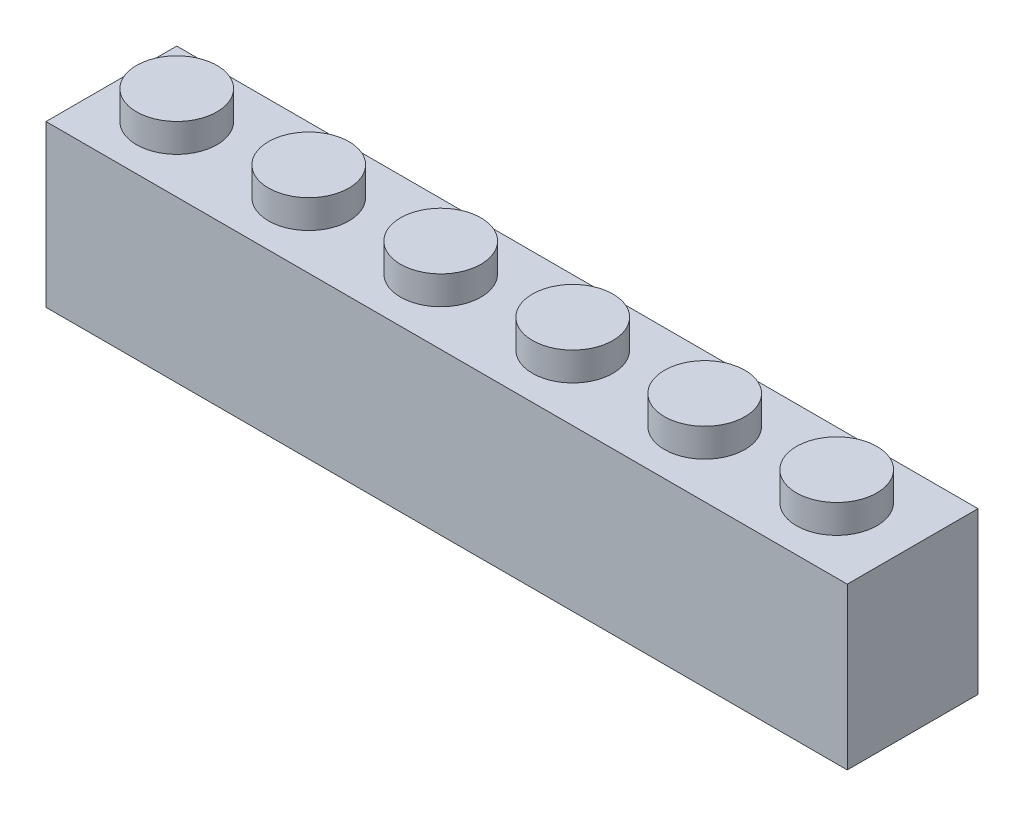
ISO-10303-21;
HEADER;
FILE_DESCRIPTION(('STEP AP214'),'2;1');
FILE_NAME('part.step','',(''),(''),'','','');
FILE_SCHEMA(('AUTOMOTIVE_DESIGN { 1 0 10303 214 1 1 1 1 }'));
ENDSEC;
DATA;
#1=APPLICATION_CONTEXT('core data for automotive mechanical design processes');
#2=APPLICATION_PROTOCOL_DEFINITION('international standard','automotive_design',2000,#1);
#3=PRODUCT_CONTEXT('',#1,'mechanical');
#4=PRODUCT('Part','Part','',(#3));
#5=PRODUCT_RELATED_PRODUCT_CATEGORY('part','',(#4));
#6=PRODUCT_DEFINITION_FORMATION('','',#4);
#7=PRODUCT_DEFINITION_CONTEXT('part definition',#1,'design');
#8=PRODUCT_DEFINITION('design','',#6,#7);
#9=PRODUCT_DEFINITION_SHAPE('','',#8);
#10=(LENGTH_UNIT() NAMED_UNIT(*) SI_UNIT(.MILLI.,.METRE.));
#11=(NAMED_UNIT(*) PLANE_ANGLE_UNIT() SI_UNIT($,.RADIAN.));
#12=(NAMED_UNIT(*) SI_UNIT($,.STERADIAN.) SOLID_ANGLE_UNIT());
#13=UNCERTAINTY_MEASURE_WITH_UNIT(LENGTH_MEASURE(1.E-05),#10,'distance_accuracy_value','');
#14=(GEOMETRIC_REPRESENTATION_CONTEXT(3) GLOBAL_UNCERTAINTY_ASSIGNED_CONTEXT((#13)) GLOBAL_UNIT_ASSIGNED_CONTEXT((#10,
#11,#12)) REPRESENTATION_CONTEXT('',''));
#15=CARTESIAN_POINT('',(0.,0.,0.));
#16=DIRECTION('',(0.,0.,1.));
#17=DIRECTION('',(1.,0.,0.));
#18=AXIS2_PLACEMENT_3D('',#15,#16,#17);
#19=CARTESIAN_POINT('',(-23.9,9.6,3.9));
#20=DIRECTION('',(1.,0.,0.));
#21=DIRECTION('',(0.,0.,-1.));
#22=AXIS2_PLACEMENT_3D('',#19,#20,#21);
#23=PLANE('',#22);
#24=DIRECTION('',(0.,0.,1.));
#25=VECTOR('',#24,1.);
#26=CARTESIAN_POINT('',(-23.9,0.,3.9));
#27=LINE('',#26,#25);
#28=CARTESIAN_POINT('',(-23.9,0.,-3.9));
#29=VERTEX_POINT('',#28);
#30=CARTESIAN_POINT('',(-23.9,0.,3.9));
#31=VERTEX_POINT('',#30);
#32=EDGE_CURVE('E96',#29,#31,#27,.T.);
#33=ORIENTED_EDGE('',*,*,#32,.T.);
#34=DIRECTION('',(0.,-1.,0.));
#35=VECTOR('',#34,1.);
#36=CARTESIAN_POINT('',(-23.9,9.6,3.9));
#37=LINE('',#36,#35);
#38=CARTESIAN_POINT('',(-23.9,9.6,3.9));
#39=VERTEX_POINT('',#38);
#40=EDGE_CURVE('E11',#39,#31,#37,.T.);
#41=ORIENTED_EDGE('',*,*,#40,.F.);
#42=DIRECTION('',(0.,0.,1.));
#43=VECTOR('',#42,1.);
#44=CARTESIAN_POINT('',(-23.9,9.6,3.9));
#45=LINE('',#44,#43);
#46=CARTESIAN_POINT('',(-23.9,9.6,-3.9));
#47=VERTEX_POINT('',#46);
#48=EDGE_CURVE('E84',#47,#39,#45,.T.);
#49=ORIENTED_EDGE('',*,*,#48,.F.);
#50=DIRECTION('',(0.,-1.,0.));
#51=VECTOR('',#50,1.);
#52=CARTESIAN_POINT('',(-23.9,9.6,-3.9));
#53=LINE('',#52,#51);
#54=EDGE_CURVE('E92',#47,#29,#53,.T.);
#55=ORIENTED_EDGE('',*,*,#54,.T.);
#56=EDGE_LOOP('',(#33,#41,#49,#55));
#57=FACE_BOUND('',#56,.T.);
#58=ADVANCED_FACE('F33',(#57),#23,.F.);
#59=CARTESIAN_POINT('',(23.9,9.6,3.89999999999999));
#60=DIRECTION('',(0.,0.,-1.));
#61=DIRECTION('',(-1.,0.,0.));
#62=AXIS2_PLACEMENT_3D('',#59,#60,#61);
#63=PLANE('',#62);
#64=DIRECTION('',(1.,0.,0.));
#65=VECTOR('',#64,1.);
#66=CARTESIAN_POINT('',(23.9,0.,3.89999999999999));
#67=LINE('',#66,#65);
#68=CARTESIAN_POINT('',(23.9,0.,3.89999999999999));
#69=VERTEX_POINT('',#68);
#70=EDGE_CURVE('E88',#31,#69,#67,.T.);
#71=ORIENTED_EDGE('',*,*,#70,.T.);
#72=DIRECTION('',(0.,-1.,0.));
#73=VECTOR('',#72,1.);
#74=CARTESIAN_POINT('',(23.9,9.6,3.89999999999999));
#75=LINE('',#74,#73);
#76=CARTESIAN_POINT('',(23.9,9.6,3.89999999999999));
#77=VERTEX_POINT('',#76);
#78=EDGE_CURVE('E41',#77,#69,#75,.T.);
#79=ORIENTED_EDGE('',*,*,#78,.F.);
#80=DIRECTION('',(1.,0.,0.));
#81=VECTOR('',#80,1.);
#82=CARTESIAN_POINT('',(23.9,9.6,3.89999999999999));
#83=LINE('',#82,#81);
#84=EDGE_CURVE('E79',#39,#77,#83,.T.);
#85=ORIENTED_EDGE('',*,*,#84,.F.);
#86=ORIENTED_EDGE('',*,*,#40,.T.);
#87=EDGE_LOOP('',(#71,#79,#85,#86));
#88=FACE_BOUND('',#87,.T.);
#89=ADVANCED_FACE('F87',(#88),#63,.F.);
#90=CARTESIAN_POINT('',(23.9,9.6,3.89999999999999));
#91=DIRECTION('',(-1.,0.,0.));
#92=DIRECTION('',(0.,0.,1.));
#93=AXIS2_PLACEMENT_3D('',#90,#91,#92);
#94=PLANE('',#93);
#95=DIRECTION('',(0.,0.,-1.));
#96=VECTOR('',#95,1.);
#97=CARTESIAN_POINT('',(23.9,0.,3.89999999999999));
#98=LINE('',#97,#96);
#99=CARTESIAN_POINT('',(23.9,0.,-3.9));
#100=VERTEX_POINT('',#99);
#101=EDGE_CURVE('E66',#69,#100,#98,.T.);
#102=ORIENTED_EDGE('',*,*,#101,.T.);
#103=DIRECTION('',(0.,-1.,0.));
#104=VECTOR('',#103,1.);
#105=CARTESIAN_POINT('',(23.9,9.6,-3.9));
#106=LINE('',#105,#104);
#107=CARTESIAN_POINT('',(23.9,9.6,-3.9));
#108=VERTEX_POINT('',#107);
#109=EDGE_CURVE('E89',#108,#100,#106,.T.);
#110=ORIENTED_EDGE('',*,*,#109,.F.);
#111=DIRECTION('',(0.,0.,-1.));
#112=VECTOR('',#111,1.);
#113=CARTESIAN_POINT('',(23.9,9.6,3.89999999999999));
#114=LINE('',#113,#112);
#115=EDGE_CURVE('E82',#77,#108,#114,.T.);
#116=ORIENTED_EDGE('',*,*,#115,.F.);
#117=ORIENTED_EDGE('',*,*,#78,.T.);
#118=EDGE_LOOP('',(#102,#110,#116,#117));
#119=FACE_BOUND('',#118,.T.);
#120=ADVANCED_FACE('F90',(#119),#94,.F.);
#121=CARTESIAN_POINT('',(23.9,9.6,-3.9));
#122=DIRECTION('',(0.,0.,1.));
#123=DIRECTION('',(1.,0.,0.));
#124=AXIS2_PLACEMENT_3D('',#121,#122,#123);
#125=PLANE('',#124);
#126=DIRECTION('',(-1.,0.,0.));
#127=VECTOR('',#126,1.);
#128=CARTESIAN_POINT('',(23.9,0.,-3.9));
#129=LINE('',#128,#127);
#130=EDGE_CURVE('E72',#100,#29,#129,.T.);
#131=ORIENTED_EDGE('',*,*,#130,.T.);
#132=ORIENTED_EDGE('',*,*,#54,.F.);
#133=DIRECTION('',(-1.,0.,0.));
#134=VECTOR('',#133,1.);
#135=CARTESIAN_POINT('',(23.9,9.6,-3.9));
#136=LINE('',#135,#134);
#137=EDGE_CURVE('E49',#108,#47,#136,.T.);
#138=ORIENTED_EDGE('',*,*,#137,.F.);
#139=ORIENTED_EDGE('',*,*,#109,.T.);
#140=EDGE_LOOP('',(#131,#132,#138,#139));
#141=FACE_BOUND('',#140,.T.);
#142=ADVANCED_FACE('F104',(#141),#125,.F.);
#143=CARTESIAN_POINT('',(0.,9.6,0.));
#144=DIRECTION('',(0.,1.,0.));
#145=DIRECTION('',(0.,0.,1.));
#146=AXIS2_PLACEMENT_3D('',#143,#144,#145);
#147=PLANE('',#146);
#148=CARTESIAN_POINT('',(19.37,9.6,0.));
#149=DIRECTION('',(0.,1.,0.));
#150=DIRECTION('',(0.,0.,1.));
#151=AXIS2_PLACEMENT_3D('',#148,#149,#150);
#152=CIRCLE('',#151,2.4);
#153=CARTESIAN_POINT('',(19.37,9.6,2.4));
#154=VERTEX_POINT('',#153);
#155=EDGE_CURVE('E140',#154,#154,#152,.T.);
#156=ORIENTED_EDGE('',*,*,#155,.F.);
#157=EDGE_LOOP('',(#156));
#158=FACE_BOUND('',#157,.T.);
#159=CARTESIAN_POINT('',(11.496,9.6,0.));
#160=DIRECTION('',(0.,1.,0.));
#161=DIRECTION('',(0.,0.,1.));
#162=AXIS2_PLACEMENT_3D('',#159,#160,#161);
#163=CIRCLE('',#162,2.4);
#164=CARTESIAN_POINT('',(11.496,9.6,2.4));
#165=VERTEX_POINT('',#164);
#166=EDGE_CURVE('E134',#165,#165,#163,.T.);
#167=ORIENTED_EDGE('',*,*,#166,.F.);
#168=EDGE_LOOP('',(#167));
#169=FACE_BOUND('',#168,.T.);
#170=CARTESIAN_POINT('',(3.62200000000001,9.6,0.));
#171=DIRECTION('',(0.,1.,0.));
#172=DIRECTION('',(0.,0.,1.));
#173=AXIS2_PLACEMENT_3D('',#170,#171,#172);
#174=CIRCLE('',#173,2.4);
#175=CARTESIAN_POINT('',(3.62200000000001,9.6,2.4));
#176=VERTEX_POINT('',#175);
#177=EDGE_CURVE('E128',#176,#176,#174,.T.);
#178=ORIENTED_EDGE('',*,*,#177,.F.);
#179=EDGE_LOOP('',(#178));
#180=FACE_BOUND('',#179,.T.);
#181=CARTESIAN_POINT('',(-4.25199999999998,9.6,0.));
#182=DIRECTION('',(0.,1.,0.));
#183=DIRECTION('',(0.,0.,1.));
#184=AXIS2_PLACEMENT_3D('',#181,#182,#183);
#185=CIRCLE('',#184,2.4);
#186=CARTESIAN_POINT('',(-4.25199999999998,9.6,2.4));
#187=VERTEX_POINT('',#186);
#188=EDGE_CURVE('E122',#187,#187,#185,.T.);
#189=ORIENTED_EDGE('',*,*,#188,.F.);
#190=EDGE_LOOP('',(#189));
#191=FACE_BOUND('',#190,.T.);
#192=CARTESIAN_POINT('',(-12.126,9.6,0.));
#193=DIRECTION('',(0.,1.,0.));
#194=DIRECTION('',(0.,0.,1.));
#195=AXIS2_PLACEMENT_3D('',#192,#193,#194);
#196=CIRCLE('',#195,2.4);
#197=CARTESIAN_POINT('',(-12.126,9.6,2.4));
#198=VERTEX_POINT('',#197);
#199=EDGE_CURVE('E116',#198,#198,#196,.T.);
#200=ORIENTED_EDGE('',*,*,#199,.F.);
#201=EDGE_LOOP('',(#200));
#202=FACE_BOUND('',#201,.T.);
#203=CARTESIAN_POINT('',(-20.,9.6,0.));
#204=DIRECTION('',(0.,1.,0.));
#205=DIRECTION('',(0.,0.,1.));
#206=AXIS2_PLACEMENT_3D('',#203,#204,#205);
#207=CIRCLE('',#206,2.4);
#208=CARTESIAN_POINT('',(-20.,9.6,2.4));
#209=VERTEX_POINT('',#208);
#210=EDGE_CURVE('E110',#209,#209,#207,.T.);
#211=ORIENTED_EDGE('',*,*,#210,.F.);
#212=EDGE_LOOP('',(#211));
#213=FACE_BOUND('',#212,.T.);
#214=ORIENTED_EDGE('',*,*,#48,.T.);
#215=ORIENTED_EDGE('',*,*,#84,.T.);
#216=ORIENTED_EDGE('',*,*,#115,.T.);
#217=ORIENTED_EDGE('',*,*,#137,.T.);
#218=EDGE_LOOP('',(#214,#215,#216,#217));
#219=FACE_BOUND('',#218,.T.);
#220=ADVANCED_FACE('F80',(#158,#169,#180,#191,#202,#213,#219),#147,.T.);
#221=CARTESIAN_POINT('',(0.,0.,0.));
#222=DIRECTION('',(0.,1.,0.));
#223=DIRECTION('',(0.,0.,1.));
#224=AXIS2_PLACEMENT_3D('',#221,#222,#223);
#225=PLANE('',#224);
#226=CARTESIAN_POINT('',(-20.,0.,0.));
#227=DIRECTION('',(0.,-1.,0.));
#228=DIRECTION('',(0.,0.,-1.));
#229=AXIS2_PLACEMENT_3D('',#226,#227,#228);
#230=CIRCLE('',#229,2.5);
#231=CARTESIAN_POINT('',(-20.,0.,-2.5));
#232=VERTEX_POINT('',#231);
#233=EDGE_CURVE('E176',#232,#232,#230,.T.);
#234=ORIENTED_EDGE('',*,*,#233,.F.);
#235=EDGE_LOOP('',(#234));
#236=FACE_BOUND('',#235,.T.);
#237=CARTESIAN_POINT('',(-12.126,0.,0.));
#238=DIRECTION('',(0.,-1.,0.));
#239=DIRECTION('',(0.,0.,-1.));
#240=AXIS2_PLACEMENT_3D('',#237,#238,#239);
#241=CIRCLE('',#240,2.5);
#242=CARTESIAN_POINT('',(-12.126,0.,-2.5));
#243=VERTEX_POINT('',#242);
#244=EDGE_CURVE('E170',#243,#243,#241,.T.);
#245=ORIENTED_EDGE('',*,*,#244,.F.);
#246=EDGE_LOOP('',(#245));
#247=FACE_BOUND('',#246,.T.);
#248=CARTESIAN_POINT('',(-4.25199999999998,0.,0.));
#249=DIRECTION('',(0.,-1.,0.));
#250=DIRECTION('',(0.,0.,-1.));
#251=AXIS2_PLACEMENT_3D('',#248,#249,#250);
#252=CIRCLE('',#251,2.5);
#253=CARTESIAN_POINT('',(-4.25199999999998,0.,-2.5));
#254=VERTEX_POINT('',#253);
#255=EDGE_CURVE('E164',#254,#254,#252,.T.);
#256=ORIENTED_EDGE('',*,*,#255,.F.);
#257=EDGE_LOOP('',(#256));
#258=FACE_BOUND('',#257,.T.);
#259=CARTESIAN_POINT('',(3.62200000000001,0.,0.));
#260=DIRECTION('',(0.,-1.,0.));
#261=DIRECTION('',(0.,0.,-1.));
#262=AXIS2_PLACEMENT_3D('',#259,#260,#261);
#263=CIRCLE('',#262,2.5);
#264=CARTESIAN_POINT('',(3.62200000000001,0.,-2.5));
#265=VERTEX_POINT('',#264);
#266=EDGE_CURVE('E158',#265,#265,#263,.T.);
#267=ORIENTED_EDGE('',*,*,#266,.F.);
#268=EDGE_LOOP('',(#267));
#269=FACE_BOUND('',#268,.T.);
#270=CARTESIAN_POINT('',(11.496,0.,0.));
#271=DIRECTION('',(0.,-1.,0.));
#272=DIRECTION('',(0.,0.,-1.));
#273=AXIS2_PLACEMENT_3D('',#270,#271,#272);
#274=CIRCLE('',#273,2.5);
#275=CARTESIAN_POINT('',(11.496,0.,-2.5));
#276=VERTEX_POINT('',#275);
#277=EDGE_CURVE('E152',#276,#276,#274,.T.);
#278=ORIENTED_EDGE('',*,*,#277,.F.);
#279=EDGE_LOOP('',(#278));
#280=FACE_BOUND('',#279,.T.);
#281=CARTESIAN_POINT('',(19.37,0.,0.));
#282=DIRECTION('',(0.,-1.,0.));
#283=DIRECTION('',(0.,0.,-1.));
#284=AXIS2_PLACEMENT_3D('',#281,#282,#283);
#285=CIRCLE('',#284,2.5);
#286=CARTESIAN_POINT('',(19.37,0.,-2.5));
#287=VERTEX_POINT('',#286);
#288=EDGE_CURVE('E146',#287,#287,#285,.T.);
#289=ORIENTED_EDGE('',*,*,#288,.F.);
#290=EDGE_LOOP('',(#289));
#291=FACE_BOUND('',#290,.T.);
#292=ORIENTED_EDGE('',*,*,#32,.F.);
#293=ORIENTED_EDGE('',*,*,#130,.F.);
#294=ORIENTED_EDGE('',*,*,#101,.F.);
#295=ORIENTED_EDGE('',*,*,#70,.F.);
#296=EDGE_LOOP('',(#292,#293,#294,#295));
#297=FACE_BOUND('',#296,.T.);
#298=ADVANCED_FACE('F107',(#236,#247,#258,#269,#280,#291,#297),#225,.F.);
#299=CARTESIAN_POINT('',(-20.,11.3,0.));
#300=DIRECTION('',(0.,-1.,0.));
#301=DIRECTION('',(0.,0.,-1.));
#302=AXIS2_PLACEMENT_3D('',#299,#300,#301);
#303=CYLINDRICAL_SURFACE('',#302,2.4);
#304=CARTESIAN_POINT('',(-20.,11.3,0.));
#305=DIRECTION('',(0.,1.,0.));
#306=DIRECTION('',(0.,0.,1.));
#307=AXIS2_PLACEMENT_3D('',#304,#305,#306);
#308=CIRCLE('',#307,2.4);
#309=CARTESIAN_POINT('',(-20.,11.3,2.4));
#310=VERTEX_POINT('',#309);
#311=EDGE_CURVE('E99',#310,#310,#308,.T.);
#312=ORIENTED_EDGE('',*,*,#311,.F.);
#313=EDGE_LOOP('',(#312));
#314=FACE_BOUND('',#313,.T.);
#315=ORIENTED_EDGE('',*,*,#210,.T.);
#316=EDGE_LOOP('',(#315));
#317=FACE_BOUND('',#316,.T.);
#318=ADVANCED_FACE('F193',(#314,#317),#303,.T.);
#319=CARTESIAN_POINT('',(-20.,11.3,0.));
#320=DIRECTION('',(0.,1.,0.));
#321=DIRECTION('',(0.,0.,1.));
#322=AXIS2_PLACEMENT_3D('',#319,#320,#321);
#323=PLANE('',#322);
#324=ORIENTED_EDGE('',*,*,#311,.T.);
#325=EDGE_LOOP('',(#324));
#326=FACE_BOUND('',#325,.T.);
#327=ADVANCED_FACE('F238',(#326),#323,.T.);
#328=CARTESIAN_POINT('',(-12.126,11.3,0.));
#329=DIRECTION('',(0.,-1.,0.));
#330=DIRECTION('',(0.,0.,-1.));
#331=AXIS2_PLACEMENT_3D('',#328,#329,#330);
#332=CYLINDRICAL_SURFACE('',#331,2.4);
#333=CARTESIAN_POINT('',(-12.126,11.3,0.));
#334=DIRECTION('',(0.,1.,0.));
#335=DIRECTION('',(0.,0.,1.));
#336=AXIS2_PLACEMENT_3D('',#333,#334,#335);
#337=CIRCLE('',#336,2.4);
#338=CARTESIAN_POINT('',(-12.126,11.3,2.4));
#339=VERTEX_POINT('',#338);
#340=EDGE_CURVE('E113',#339,#339,#337,.T.);
#341=ORIENTED_EDGE('',*,*,#340,.F.);
#342=EDGE_LOOP('',(#341));
#343=FACE_BOUND('',#342,.T.);
#344=ORIENTED_EDGE('',*,*,#199,.T.);
#345=EDGE_LOOP('',(#344));
#346=FACE_BOUND('',#345,.T.);
#347=ADVANCED_FACE('F242',(#343,#346),#332,.T.);
#348=CARTESIAN_POINT('',(-12.126,11.3,0.));
#349=DIRECTION('',(0.,1.,0.));
#350=DIRECTION('',(0.,0.,1.));
#351=AXIS2_PLACEMENT_3D('',#348,#349,#350);
#352=PLANE('',#351);
#353=ORIENTED_EDGE('',*,*,#340,.T.);
#354=EDGE_LOOP('',(#353));
#355=FACE_BOUND('',#354,.T.);
#356=ADVANCED_FACE('F246',(#355),#352,.T.);
#357=CARTESIAN_POINT('',(-4.25199999999998,11.3,0.));
#358=DIRECTION('',(0.,-1.,0.));
#359=DIRECTION('',(0.,0.,-1.));
#360=AXIS2_PLACEMENT_3D('',#357,#358,#359);
#361=CYLINDRICAL_SURFACE('',#360,2.4);
#362=CARTESIAN_POINT('',(-4.25199999999998,11.3,0.));
#363=DIRECTION('',(0.,1.,0.));
#364=DIRECTION('',(0.,0.,1.));
#365=AXIS2_PLACEMENT_3D('',#362,#363,#364);
#366=CIRCLE('',#365,2.4);
#367=CARTESIAN_POINT('',(-4.25199999999998,11.3,2.4));
#368=VERTEX_POINT('',#367);
#369=EDGE_CURVE('E119',#368,#368,#366,.T.);
#370=ORIENTED_EDGE('',*,*,#369,.F.);
#371=EDGE_LOOP('',(#370));
#372=FACE_BOUND('',#371,.T.);
#373=ORIENTED_EDGE('',*,*,#188,.T.);
#374=EDGE_LOOP('',(#373));
#375=FACE_BOUND('',#374,.T.);
#376=ADVANCED_FACE('F250',(#372,#375),#361,.T.);
#377=CARTESIAN_POINT('',(-4.25199999999998,11.3,0.));
#378=DIRECTION('',(0.,1.,0.));
#379=DIRECTION('',(0.,0.,1.));
#380=AXIS2_PLACEMENT_3D('',#377,#378,#379);
#381=PLANE('',#380);
#382=ORIENTED_EDGE('',*,*,#369,.T.);
#383=EDGE_LOOP('',(#382));
#384=FACE_BOUND('',#383,.T.);
#385=ADVANCED_FACE('F254',(#384),#381,.T.);
#386=CARTESIAN_POINT('',(3.62200000000001,11.3,0.));
#387=DIRECTION('',(0.,-1.,0.));
#388=DIRECTION('',(0.,0.,-1.));
#389=AXIS2_PLACEMENT_3D('',#386,#387,#388);
#390=CYLINDRICAL_SURFACE('',#389,2.4);
#391=CARTESIAN_POINT('',(3.62200000000001,11.3,0.));
#392=DIRECTION('',(0.,1.,0.));
#393=DIRECTION('',(0.,0.,1.));
#394=AXIS2_PLACEMENT_3D('',#391,#392,#393);
#395=CIRCLE('',#394,2.4);
#396=CARTESIAN_POINT('',(3.62200000000001,11.3,2.4));
#397=VERTEX_POINT('',#396);
#398=EDGE_CURVE('E125',#397,#397,#395,.T.);
#399=ORIENTED_EDGE('',*,*,#398,.F.);
#400=EDGE_LOOP('',(#399));
#401=FACE_BOUND('',#400,.T.);
#402=ORIENTED_EDGE('',*,*,#177,.T.);
#403=EDGE_LOOP('',(#402));
#404=FACE_BOUND('',#403,.T.);
#405=ADVANCED_FACE('F258',(#401,#404),#390,.T.);
#406=CARTESIAN_POINT('',(3.62200000000001,11.3,0.));
#407=DIRECTION('',(0.,1.,0.));
#408=DIRECTION('',(0.,0.,1.));
#409=AXIS2_PLACEMENT_3D('',#406,#407,#408);
#410=PLANE('',#409);
#411=ORIENTED_EDGE('',*,*,#398,.T.);
#412=EDGE_LOOP('',(#411));
#413=FACE_BOUND('',#412,.T.);
#414=ADVANCED_FACE('F262',(#413),#410,.T.);
#415=CARTESIAN_POINT('',(11.496,11.3,0.));
#416=DIRECTION('',(0.,-1.,0.));
#417=DIRECTION('',(0.,0.,-1.));
#418=AXIS2_PLACEMENT_3D('',#415,#416,#417);
#419=CYLINDRICAL_SURFACE('',#418,2.4);
#420=CARTESIAN_POINT('',(11.496,11.3,0.));
#421=DIRECTION('',(0.,1.,0.));
#422=DIRECTION('',(0.,0.,1.));
#423=AXIS2_PLACEMENT_3D('',#420,#421,#422);
#424=CIRCLE('',#423,2.4);
#425=CARTESIAN_POINT('',(11.496,11.3,2.4));
#426=VERTEX_POINT('',#425);
#427=EDGE_CURVE('E131',#426,#426,#424,.T.);
#428=ORIENTED_EDGE('',*,*,#427,.F.);
#429=EDGE_LOOP('',(#428));
#430=FACE_BOUND('',#429,.T.);
#431=ORIENTED_EDGE('',*,*,#166,.T.);
#432=EDGE_LOOP('',(#431));
#433=FACE_BOUND('',#432,.T.);
#434=ADVANCED_FACE('F266',(#430,#433),#419,.T.);
#435=CARTESIAN_POINT('',(11.496,11.3,0.));
#436=DIRECTION('',(0.,1.,0.));
#437=DIRECTION('',(0.,0.,1.));
#438=AXIS2_PLACEMENT_3D('',#435,#436,#437);
#439=PLANE('',#438);
#440=ORIENTED_EDGE('',*,*,#427,.T.);
#441=EDGE_LOOP('',(#440));
#442=FACE_BOUND('',#441,.T.);
#443=ADVANCED_FACE('F270',(#442),#439,.T.);
#444=CARTESIAN_POINT('',(19.37,11.3,0.));
#445=DIRECTION('',(0.,-1.,0.));
#446=DIRECTION('',(0.,0.,-1.));
#447=AXIS2_PLACEMENT_3D('',#444,#445,#446);
#448=CYLINDRICAL_SURFACE('',#447,2.4);
#449=CARTESIAN_POINT('',(19.37,11.3,0.));
#450=DIRECTION('',(0.,1.,0.));
#451=DIRECTION('',(0.,0.,1.));
#452=AXIS2_PLACEMENT_3D('',#449,#450,#451);
#453=CIRCLE('',#452,2.4);
#454=CARTESIAN_POINT('',(19.37,11.3,2.4));
#455=VERTEX_POINT('',#454);
#456=EDGE_CURVE('E137',#455,#455,#453,.T.);
#457=ORIENTED_EDGE('',*,*,#456,.F.);
#458=EDGE_LOOP('',(#457));
#459=FACE_BOUND('',#458,.T.);
#460=ORIENTED_EDGE('',*,*,#155,.T.);
#461=EDGE_LOOP('',(#460));
#462=FACE_BOUND('',#461,.T.);
#463=ADVANCED_FACE('F218',(#459,#462),#448,.T.);
#464=CARTESIAN_POINT('',(19.37,11.3,0.));
#465=DIRECTION('',(0.,1.,0.));
#466=DIRECTION('',(0.,0.,1.));
#467=AXIS2_PLACEMENT_3D('',#464,#465,#466);
#468=PLANE('',#467);
#469=ORIENTED_EDGE('',*,*,#456,.T.);
#470=EDGE_LOOP('',(#469));
#471=FACE_BOUND('',#470,.T.);
#472=ADVANCED_FACE('F208',(#471),#468,.T.);
#473=CARTESIAN_POINT('',(19.37,1.8,0.));
#474=DIRECTION('',(0.,-1.,0.));
#475=DIRECTION('',(0.,0.,-1.));
#476=AXIS2_PLACEMENT_3D('',#473,#474,#475);
#477=CYLINDRICAL_SURFACE('',#476,2.5);
#478=CARTESIAN_POINT('',(19.37,1.8,0.));
#479=DIRECTION('',(0.,-1.,0.));
#480=DIRECTION('',(0.,0.,-1.));
#481=AXIS2_PLACEMENT_3D('',#478,#479,#480);
#482=CIRCLE('',#481,2.5);
#483=CARTESIAN_POINT('',(19.37,1.8,-2.5));
#484=VERTEX_POINT('',#483);
#485=EDGE_CURVE('E149',#484,#484,#482,.T.);
#486=ORIENTED_EDGE('',*,*,#485,.F.);
#487=EDGE_LOOP('',(#486));
#488=FACE_BOUND('',#487,.T.);
#489=ORIENTED_EDGE('',*,*,#288,.T.);
#490=EDGE_LOOP('',(#489));
#491=FACE_BOUND('',#490,.T.);
#492=ADVANCED_FACE('F205',(#488,#491),#477,.F.);
#493=CARTESIAN_POINT('',(19.37,1.8,0.));
#494=DIRECTION('',(0.,-1.,0.));
#495=DIRECTION('',(0.,0.,-1.));
#496=AXIS2_PLACEMENT_3D('',#493,#494,#495);
#497=PLANE('',#496);
#498=ORIENTED_EDGE('',*,*,#485,.T.);
#499=EDGE_LOOP('',(#498));
#500=FACE_BOUND('',#499,.T.);
#501=ADVANCED_FACE('F207',(#500),#497,.T.);
#502=CARTESIAN_POINT('',(11.496,1.8,0.));
#503=DIRECTION('',(0.,-1.,0.));
#504=DIRECTION('',(0.,0.,-1.));
#505=AXIS2_PLACEMENT_3D('',#502,#503,#504);
#506=CYLINDRICAL_SURFACE('',#505,2.5);
#507=CARTESIAN_POINT('',(11.496,1.8,0.));
#508=DIRECTION('',(0.,-1.,0.));
#509=DIRECTION('',(0.,0.,-1.));
#510=AXIS2_PLACEMENT_3D('',#507,#508,#509);
#511=CIRCLE('',#510,2.5);
#512=CARTESIAN_POINT('',(11.496,1.8,-2.5));
#513=VERTEX_POINT('',#512);
#514=EDGE_CURVE('E155',#513,#513,#511,.T.);
#515=ORIENTED_EDGE('',*,*,#514,.F.);
#516=EDGE_LOOP('',(#515));
#517=FACE_BOUND('',#516,.T.);
#518=ORIENTED_EDGE('',*,*,#277,.T.);
#519=EDGE_LOOP('',(#518));
#520=FACE_BOUND('',#519,.T.);
#521=ADVANCED_FACE('F215',(#517,#520),#506,.F.);
#522=CARTESIAN_POINT('',(11.496,1.8,0.));
#523=DIRECTION('',(0.,-1.,0.));
#524=DIRECTION('',(0.,0.,-1.));
#525=AXIS2_PLACEMENT_3D('',#522,#523,#524);
#526=PLANE('',#525);
#527=ORIENTED_EDGE('',*,*,#514,.T.);
#528=EDGE_LOOP('',(#527));
#529=FACE_BOUND('',#528,.T.);
#530=ADVANCED_FACE('F330',(#529),#526,.T.);
#531=CARTESIAN_POINT('',(3.62200000000001,1.8,0.));
#532=DIRECTION('',(0.,-1.,0.));
#533=DIRECTION('',(0.,0.,-1.));
#534=AXIS2_PLACEMENT_3D('',#531,#532,#533);
#535=CYLINDRICAL_SURFACE('',#534,2.5);
#536=CARTESIAN_POINT('',(3.62200000000001,1.8,0.));
#537=DIRECTION('',(0.,-1.,0.));
#538=DIRECTION('',(0.,0.,-1.));
#539=AXIS2_PLACEMENT_3D('',#536,#537,#538);
#540=CIRCLE('',#539,2.5);
#541=CARTESIAN_POINT('',(3.62200000000001,1.8,-2.5));
#542=VERTEX_POINT('',#541);
#543=EDGE_CURVE('E161',#542,#542,#540,.T.);
#544=ORIENTED_EDGE('',*,*,#543,.F.);
#545=EDGE_LOOP('',(#544));
#546=FACE_BOUND('',#545,.T.);
#547=ORIENTED_EDGE('',*,*,#266,.T.);
#548=EDGE_LOOP('',(#547));
#549=FACE_BOUND('',#548,.T.);
#550=ADVANCED_FACE('F340',(#546,#549),#535,.F.);
#551=CARTESIAN_POINT('',(3.62200000000001,1.8,0.));
#552=DIRECTION('',(0.,-1.,0.));
#553=DIRECTION('',(0.,0.,-1.));
#554=AXIS2_PLACEMENT_3D('',#551,#552,#553);
#555=PLANE('',#554);
#556=ORIENTED_EDGE('',*,*,#543,.T.);
#557=EDGE_LOOP('',(#556));
#558=FACE_BOUND('',#557,.T.);
#559=ADVANCED_FACE('F350',(#558),#555,.T.);
#560=CARTESIAN_POINT('',(-4.25199999999998,1.8,0.));
#561=DIRECTION('',(0.,-1.,0.));
#562=DIRECTION('',(0.,0.,-1.));
#563=AXIS2_PLACEMENT_3D('',#560,#561,#562);
#564=CYLINDRICAL_SURFACE('',#563,2.5);
#565=CARTESIAN_POINT('',(-4.25199999999998,1.8,0.));
#566=DIRECTION('',(0.,-1.,0.));
#567=DIRECTION('',(0.,0.,-1.));
#568=AXIS2_PLACEMENT_3D('',#565,#566,#567);
#569=CIRCLE('',#568,2.5);
#570=CARTESIAN_POINT('',(-4.25199999999998,1.8,-2.5));
#571=VERTEX_POINT('',#570);
#572=EDGE_CURVE('E167',#571,#571,#569,.T.);
#573=ORIENTED_EDGE('',*,*,#572,.F.);
#574=EDGE_LOOP('',(#573));
#575=FACE_BOUND('',#574,.T.);
#576=ORIENTED_EDGE('',*,*,#255,.T.);
#577=EDGE_LOOP('',(#576));
#578=FACE_BOUND('',#577,.T.);
#579=ADVANCED_FACE('F360',(#575,#578),#564,.F.);
#580=CARTESIAN_POINT('',(-4.25199999999998,1.8,0.));
#581=DIRECTION('',(0.,-1.,0.));
#582=DIRECTION('',(0.,0.,-1.));
#583=AXIS2_PLACEMENT_3D('',#580,#581,#582);
#584=PLANE('',#583);
#585=ORIENTED_EDGE('',*,*,#572,.T.);
#586=EDGE_LOOP('',(#585));
#587=FACE_BOUND('',#586,.T.);
#588=ADVANCED_FACE('F370',(#587),#584,.T.);
#589=CARTESIAN_POINT('',(-12.126,1.8,0.));
#590=DIRECTION('',(0.,-1.,0.));
#591=DIRECTION('',(0.,0.,-1.));
#592=AXIS2_PLACEMENT_3D('',#589,#590,#591);
#593=CYLINDRICAL_SURFACE('',#592,2.5);
#594=CARTESIAN_POINT('',(-12.126,1.8,0.));
#595=DIRECTION('',(0.,-1.,0.));
#596=DIRECTION('',(0.,0.,-1.));
#597=AXIS2_PLACEMENT_3D('',#594,#595,#596);
#598=CIRCLE('',#597,2.5);
#599=CARTESIAN_POINT('',(-12.126,1.8,-2.5));
#600=VERTEX_POINT('',#599);
#601=EDGE_CURVE('E173',#600,#600,#598,.T.);
#602=ORIENTED_EDGE('',*,*,#601,.F.);
#603=EDGE_LOOP('',(#602));
#604=FACE_BOUND('',#603,.T.);
#605=ORIENTED_EDGE('',*,*,#244,.T.);
#606=EDGE_LOOP('',(#605));
#607=FACE_BOUND('',#606,.T.);
#608=ADVANCED_FACE('F380',(#604,#607),#593,.F.);
#609=CARTESIAN_POINT('',(-12.126,1.8,0.));
#610=DIRECTION('',(0.,-1.,0.));
#611=DIRECTION('',(0.,0.,-1.));
#612=AXIS2_PLACEMENT_3D('',#609,#610,#611);
#613=PLANE('',#612);
#614=ORIENTED_EDGE('',*,*,#601,.T.);
#615=EDGE_LOOP('',(#614));
#616=FACE_BOUND('',#615,.T.);
#617=ADVANCED_FACE('F187',(#616),#613,.T.);
#618=CARTESIAN_POINT('',(-20.,1.8,0.));
#619=DIRECTION('',(0.,-1.,0.));
#620=DIRECTION('',(0.,0.,-1.));
#621=AXIS2_PLACEMENT_3D('',#618,#619,#620);
#622=CYLINDRICAL_SURFACE('',#621,2.5);
#623=CARTESIAN_POINT('',(-20.,1.8,0.));
#624=DIRECTION('',(0.,-1.,0.));
#625=DIRECTION('',(0.,0.,-1.));
#626=AXIS2_PLACEMENT_3D('',#623,#624,#625);
#627=CIRCLE('',#626,2.5);
#628=CARTESIAN_POINT('',(-20.,1.8,-2.5));
#629=VERTEX_POINT('',#628);
#630=EDGE_CURVE('E143',#629,#629,#627,.T.);
#631=ORIENTED_EDGE('',*,*,#630,.F.);
#632=EDGE_LOOP('',(#631));
#633=FACE_BOUND('',#632,.T.);
#634=ORIENTED_EDGE('',*,*,#233,.T.);
#635=EDGE_LOOP('',(#634));
#636=FACE_BOUND('',#635,.T.);
#637=ADVANCED_FACE('F184',(#633,#636),#622,.F.);
#638=CARTESIAN_POINT('',(-20.,1.8,0.));
#639=DIRECTION('',(0.,-1.,0.));
#640=DIRECTION('',(0.,0.,-1.));
#641=AXIS2_PLACEMENT_3D('',#638,#639,#640);
#642=PLANE('',#641);
#643=ORIENTED_EDGE('',*,*,#630,.T.);
#644=EDGE_LOOP('',(#643));
#645=FACE_BOUND('',#644,.T.);
#646=ADVANCED_FACE('F182',(#645),#642,.T.);
#647=CLOSED_SHELL('',(#58,#89,#120,#142,#220,#298,#318,#327,#347,#356,#376,#385,#405,#414,#434,
#443,#463,#472,#492,#501,#521,#530,#550,#559,#579,#588,#608,#617,#637,#646));
#648=MANIFOLD_SOLID_BREP('B2',#647);
#649=ADVANCED_BREP_SHAPE_REPRESENTATION('',(#18,#648),#14);
#650=SHAPE_DEFINITION_REPRESENTATION(#9,#649);
ENDSEC;
END-ISO-10303-21;
